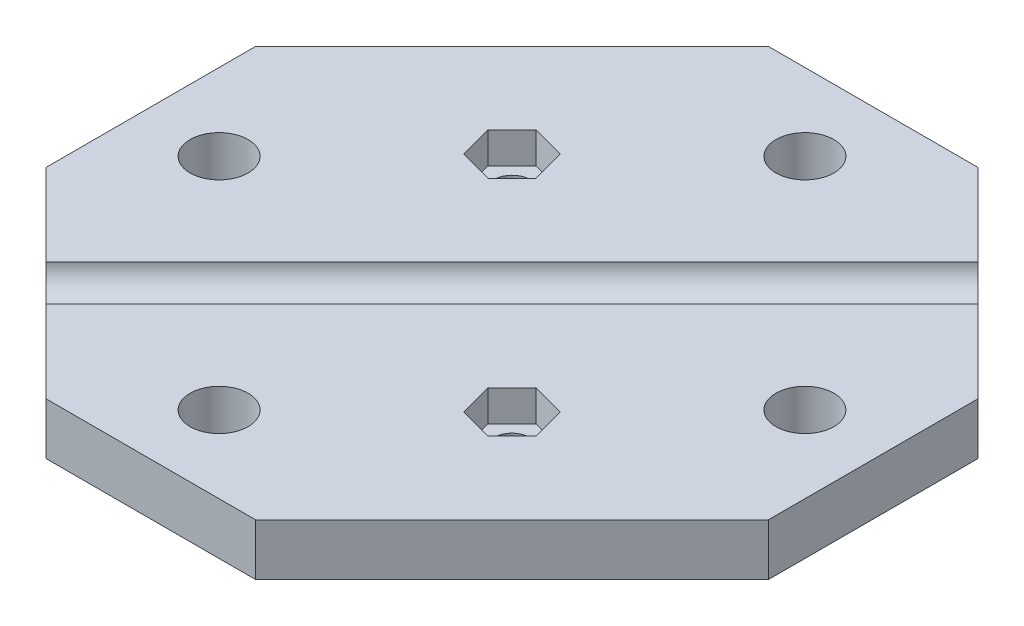
ISO-10303-21;
HEADER;
FILE_DESCRIPTION(('STEP AP214'),'2;1');
FILE_NAME('part.step','',(''),(''),'','','');
FILE_SCHEMA(('AUTOMOTIVE_DESIGN { 1 0 10303 214 1 1 1 1 }'));
ENDSEC;
DATA;
#1=APPLICATION_CONTEXT('core data for automotive mechanical design processes');
#2=APPLICATION_PROTOCOL_DEFINITION('international standard','automotive_design',2000,#1);
#3=PRODUCT_CONTEXT('',#1,'mechanical');
#4=PRODUCT('Part','Part','',(#3));
#5=PRODUCT_RELATED_PRODUCT_CATEGORY('part','',(#4));
#6=PRODUCT_DEFINITION_FORMATION('','',#4);
#7=PRODUCT_DEFINITION_CONTEXT('part definition',#1,'design');
#8=PRODUCT_DEFINITION('design','',#6,#7);
#9=PRODUCT_DEFINITION_SHAPE('','',#8);
#10=(LENGTH_UNIT() NAMED_UNIT(*) SI_UNIT(.MILLI.,.METRE.));
#11=(NAMED_UNIT(*) PLANE_ANGLE_UNIT() SI_UNIT($,.RADIAN.));
#12=(NAMED_UNIT(*) SI_UNIT($,.STERADIAN.) SOLID_ANGLE_UNIT());
#13=UNCERTAINTY_MEASURE_WITH_UNIT(LENGTH_MEASURE(1.E-05),#10,'distance_accuracy_value','');
#14=(GEOMETRIC_REPRESENTATION_CONTEXT(3) GLOBAL_UNCERTAINTY_ASSIGNED_CONTEXT((#13)) GLOBAL_UNIT_ASSIGNED_CONTEXT((#10,
#11,#12)) REPRESENTATION_CONTEXT('',''));
#15=CARTESIAN_POINT('',(0.,0.,0.));
#16=DIRECTION('',(0.,0.,1.));
#17=DIRECTION('',(1.,0.,0.));
#18=AXIS2_PLACEMENT_3D('',#15,#16,#17);
#19=CARTESIAN_POINT('',(0.,5.,0.));
#20=DIRECTION('',(0.,-1.,0.));
#21=DIRECTION('',(0.,0.,-1.));
#22=AXIS2_PLACEMENT_3D('',#19,#20,#21);
#23=PLANE('',#22);
#24=DIRECTION('',(-0.965925826289068,0.,-0.258819045102523));
#25=VECTOR('',#24,1.);
#26=CARTESIAN_POINT('',(-16.5869477278591,5.,-21.2409782391472));
#27=LINE('',#26,#25);
#28=CARTESIAN_POINT('',(-16.5869477278591,5.,-21.2409782391472));
#29=VERTEX_POINT('',#28);
#30=CARTESIAN_POINT('',(-19.7657096820628,5.,-22.0927249377069));
#31=VERTEX_POINT('',#30);
#32=EDGE_CURVE('E241',#29,#31,#27,.T.);
#33=ORIENTED_EDGE('',*,*,#32,.F.);
#34=DIRECTION('',(-0.258819045102519,0.,-0.965925826289069));
#35=VECTOR('',#34,1.);
#36=CARTESIAN_POINT('',(-15.7352010292995,5.,-18.0622162849435));
#37=LINE('',#36,#35);
#38=CARTESIAN_POINT('',(-15.7352010292995,5.,-18.0622162849435));
#39=VERTEX_POINT('',#38);
#40=EDGE_CURVE('E60',#39,#29,#37,.T.);
#41=ORIENTED_EDGE('',*,*,#40,.F.);
#42=DIRECTION('',(0.707106781186549,0.,-0.707106781186546));
#43=VECTOR('',#42,1.);
#44=CARTESIAN_POINT('',(-18.0622162849435,5.,-15.7352010292995));
#45=LINE('',#44,#43);
#46=CARTESIAN_POINT('',(-18.0622162849435,5.,-15.7352010292995));
#47=VERTEX_POINT('',#46);
#48=EDGE_CURVE('E218',#47,#39,#45,.T.);
#49=ORIENTED_EDGE('',*,*,#48,.F.);
#50=DIRECTION('',(0.965925826289068,0.,0.258819045102523));
#51=VECTOR('',#50,1.);
#52=CARTESIAN_POINT('',(-21.2409782391472,5.,-16.5869477278592));
#53=LINE('',#52,#51);
#54=CARTESIAN_POINT('',(-21.2409782391472,5.,-16.5869477278592));
#55=VERTEX_POINT('',#54);
#56=EDGE_CURVE('E222',#55,#47,#53,.T.);
#57=ORIENTED_EDGE('',*,*,#56,.F.);
#58=DIRECTION('',(0.258819045102518,0.,0.965925826289069));
#59=VECTOR('',#58,1.);
#60=CARTESIAN_POINT('',(-22.0927249377068,5.,-19.7657096820628));
#61=LINE('',#60,#59);
#62=CARTESIAN_POINT('',(-22.0927249377068,5.,-19.7657096820628));
#63=VERTEX_POINT('',#62);
#64=EDGE_CURVE('E248',#63,#55,#61,.T.);
#65=ORIENTED_EDGE('',*,*,#64,.F.);
#66=DIRECTION('',(-0.707106781186549,0.,0.707106781186546));
#67=VECTOR('',#66,1.);
#68=CARTESIAN_POINT('',(-19.7657096820628,5.,-22.0927249377069));
#69=LINE('',#68,#67);
#70=EDGE_CURVE('E244',#31,#63,#69,.T.);
#71=ORIENTED_EDGE('',*,*,#70,.F.);
#72=EDGE_LOOP('',(#33,#41,#49,#57,#65,#71));
#73=FACE_BOUND('',#72,.T.);
#74=CARTESIAN_POINT('',(-32.8793219119375,5.,-4.59505066447559));
#75=DIRECTION('',(0.,1.,0.));
#76=DIRECTION('',(0.,0.,1.));
#77=AXIS2_PLACEMENT_3D('',#74,#75,#76);
#78=CIRCLE('',#77,2.8);
#79=CARTESIAN_POINT('',(-32.8793219119375,5.,-1.79505066447559));
#80=VERTEX_POINT('',#79);
#81=EDGE_CURVE('E348',#80,#80,#78,.T.);
#82=ORIENTED_EDGE('',*,*,#81,.F.);
#83=EDGE_LOOP('',(#82));
#84=FACE_BOUND('',#83,.T.);
#85=CARTESIAN_POINT('',(-4.59505066447554,5.,-32.8793219119374));
#86=DIRECTION('',(0.,1.,0.));
#87=DIRECTION('',(0.,0.,1.));
#88=AXIS2_PLACEMENT_3D('',#85,#86,#87);
#89=CIRCLE('',#88,2.8);
#90=CARTESIAN_POINT('',(-4.59505066447554,5.,-30.0793219119374));
#91=VERTEX_POINT('',#90);
#92=EDGE_CURVE('E356',#91,#91,#89,.T.);
#93=ORIENTED_EDGE('',*,*,#92,.F.);
#94=EDGE_LOOP('',(#93));
#95=FACE_BOUND('',#94,.T.);
#96=DIRECTION('',(0.707106781186547,0.,0.707106781186549));
#97=VECTOR('',#96,1.);
#98=CARTESIAN_POINT('',(-40.3039431143962,5.,4.69479422713291));
#99=LINE('',#98,#97);
#100=CARTESIAN_POINT('',(-40.3039431143962,5.,4.69479422713291));
#101=VERTEX_POINT('',#100);
#102=CARTESIAN_POINT('',(-32.3977201941393,5.,12.6010171473899));
#103=VERTEX_POINT('',#102);
#104=EDGE_CURVE('E386',#101,#103,#99,.T.);
#105=ORIENTED_EDGE('',*,*,#104,.T.);
#106=DIRECTION('',(0.707106781186549,0.,-0.707106781186546));
#107=VECTOR('',#106,1.);
#108=CARTESIAN_POINT('',(-42.0727100673626,5.,22.2760070206132));
#109=LINE('',#108,#107);
#110=CARTESIAN_POINT('',(12.60101714739,5.,-32.3977201941392));
#111=VERTEX_POINT('',#110);
#112=EDGE_CURVE('E340',#103,#111,#109,.T.);
#113=ORIENTED_EDGE('',*,*,#112,.T.);
#114=DIRECTION('',(-0.707106781186546,0.,-0.707106781186549));
#115=VECTOR('',#114,1.);
#116=CARTESIAN_POINT('',(4.69479422713301,5.,-40.3039431143962));
#117=LINE('',#116,#115);
#118=CARTESIAN_POINT('',(4.69479422713301,5.,-40.3039431143962));
#119=VERTEX_POINT('',#118);
#120=EDGE_CURVE('E399',#111,#119,#117,.T.);
#121=ORIENTED_EDGE('',*,*,#120,.T.);
#122=DIRECTION('',(-1.,0.,0.));
#123=VECTOR('',#122,1.);
#124=CARTESIAN_POINT('',(-15.555205772867,5.,-40.3039431143962));
#125=LINE('',#124,#123);
#126=CARTESIAN_POINT('',(-15.555205772867,5.,-40.3039431143962));
#127=VERTEX_POINT('',#126);
#128=EDGE_CURVE('E404',#119,#127,#125,.T.);
#129=ORIENTED_EDGE('',*,*,#128,.T.);
#130=DIRECTION('',(-0.707106781186549,0.,0.707106781186546));
#131=VECTOR('',#130,1.);
#132=CARTESIAN_POINT('',(-40.3039431143962,5.,-15.5552057728671));
#133=LINE('',#132,#131);
#134=CARTESIAN_POINT('',(-40.3039431143962,5.,-15.5552057728671));
#135=VERTEX_POINT('',#134);
#136=EDGE_CURVE('E407',#127,#135,#133,.T.);
#137=ORIENTED_EDGE('',*,*,#136,.T.);
#138=DIRECTION('',(0.,0.,1.));
#139=VECTOR('',#138,1.);
#140=CARTESIAN_POINT('',(-40.3039431143962,5.,-15.5552057728671));
#141=LINE('',#140,#139);
#142=EDGE_CURVE('E380',#135,#101,#141,.T.);
#143=ORIENTED_EDGE('',*,*,#142,.T.);
#144=EDGE_LOOP('',(#105,#113,#121,#129,#137,#143));
#145=FACE_BOUND('',#144,.T.);
#146=ADVANCED_FACE('F44',(#73,#84,#95,#145),#23,.F.);
#147=DIRECTION('',(-0.965925826289068,0.,-0.258819045102523));
#148=VECTOR('',#147,1.);
#149=CARTESIAN_POINT('',(4.97980909833059,5.,0.325778587042475));
#150=LINE('',#149,#148);
#151=CARTESIAN_POINT('',(4.97980909833059,5.,0.325778587042475));
#152=VERTEX_POINT('',#151);
#153=CARTESIAN_POINT('',(1.80104714412692,5.,-0.525968111517182));
#154=VERTEX_POINT('',#153);
#155=EDGE_CURVE('E307',#152,#154,#150,.T.);
#156=ORIENTED_EDGE('',*,*,#155,.F.);
#157=DIRECTION('',(-0.258819045102519,0.,-0.965925826289069));
#158=VECTOR('',#157,1.);
#159=CARTESIAN_POINT('',(5.83155579689024,5.,3.50454054124615));
#160=LINE('',#159,#158);
#161=CARTESIAN_POINT('',(5.83155579689024,5.,3.50454054124615));
#162=VERTEX_POINT('',#161);
#163=EDGE_CURVE('E68',#162,#152,#160,.T.);
#164=ORIENTED_EDGE('',*,*,#163,.F.);
#165=DIRECTION('',(0.707106781186549,0.,-0.707106781186546));
#166=VECTOR('',#165,1.);
#167=CARTESIAN_POINT('',(3.50454054124621,5.,5.83155579689016));
#168=LINE('',#167,#166);
#169=CARTESIAN_POINT('',(3.50454054124621,5.,5.83155579689016));
#170=VERTEX_POINT('',#169);
#171=EDGE_CURVE('E290',#170,#162,#168,.T.);
#172=ORIENTED_EDGE('',*,*,#171,.F.);
#173=DIRECTION('',(0.965925826289068,0.,0.258819045102523));
#174=VECTOR('',#173,1.);
#175=CARTESIAN_POINT('',(0.325778587042545,5.,4.9798090983305));
#176=LINE('',#175,#174);
#177=CARTESIAN_POINT('',(0.325778587042545,5.,4.9798090983305));
#178=VERTEX_POINT('',#177);
#179=EDGE_CURVE('E294',#178,#170,#176,.T.);
#180=ORIENTED_EDGE('',*,*,#179,.F.);
#181=DIRECTION('',(0.258819045102519,0.,0.965925826289069));
#182=VECTOR('',#181,1.);
#183=CARTESIAN_POINT('',(-0.5259681115171,5.,1.80104714412683));
#184=LINE('',#183,#182);
#185=CARTESIAN_POINT('',(-0.5259681115171,5.,1.80104714412683));
#186=VERTEX_POINT('',#185);
#187=EDGE_CURVE('E299',#186,#178,#184,.T.);
#188=ORIENTED_EDGE('',*,*,#187,.F.);
#189=DIRECTION('',(-0.707106781186549,0.,0.707106781186546));
#190=VECTOR('',#189,1.);
#191=CARTESIAN_POINT('',(1.80104714412692,5.,-0.525968111517182));
#192=LINE('',#191,#190);
#193=EDGE_CURVE('E303',#154,#186,#192,.T.);
#194=ORIENTED_EDGE('',*,*,#193,.F.);
#195=EDGE_LOOP('',(#156,#164,#172,#180,#188,#194));
#196=FACE_BOUND('',#195,.T.);
#197=CARTESIAN_POINT('',(24.0427739735796,5.,-20.9559633679495));
#198=VERTEX_POINT('',#197);
#199=CARTESIAN_POINT('',(16.1365510533227,5.,-28.8621862882065));
#200=VERTEX_POINT('',#199);
#201=EDGE_CURVE('E400',#198,#200,#117,.T.);
#202=ORIENTED_EDGE('',*,*,#201,.T.);
#203=DIRECTION('',(0.707106781186549,0.,-0.707106781186546));
#204=VECTOR('',#203,1.);
#205=CARTESIAN_POINT('',(-38.5371761614299,5.,25.8115409265459));
#206=LINE('',#205,#204);
#207=CARTESIAN_POINT('',(-28.8621862882066,5.,16.1365510533226));
#208=VERTEX_POINT('',#207);
#209=EDGE_CURVE('E341',#208,#200,#206,.T.);
#210=ORIENTED_EDGE('',*,*,#209,.F.);
#211=CARTESIAN_POINT('',(-20.9559633679496,5.,24.0427739735796));
#212=VERTEX_POINT('',#211);
#213=EDGE_CURVE('E384',#208,#212,#99,.T.);
#214=ORIENTED_EDGE('',*,*,#213,.T.);
#215=DIRECTION('',(1.,0.,0.));
#216=VECTOR('',#215,1.);
#217=CARTESIAN_POINT('',(-0.705963367949583,5.,24.0427739735796));
#218=LINE('',#217,#216);
#219=CARTESIAN_POINT('',(-0.705963367949583,5.,24.0427739735796));
#220=VERTEX_POINT('',#219);
#221=EDGE_CURVE('E390',#212,#220,#218,.T.);
#222=ORIENTED_EDGE('',*,*,#221,.T.);
#223=DIRECTION('',(0.707106781186549,0.,-0.707106781186546));
#224=VECTOR('',#223,1.);
#225=CARTESIAN_POINT('',(-0.705963367949583,5.,24.0427739735796));
#226=LINE('',#225,#224);
#227=CARTESIAN_POINT('',(24.0427739735796,5.,-0.705963367949539));
#228=VERTEX_POINT('',#227);
#229=EDGE_CURVE('E393',#220,#228,#226,.T.);
#230=ORIENTED_EDGE('',*,*,#229,.T.);
#231=DIRECTION('',(0.,0.,-1.));
#232=VECTOR('',#231,1.);
#233=CARTESIAN_POINT('',(24.0427739735796,5.,-0.705963367949539));
#234=LINE('',#233,#232);
#235=EDGE_CURVE('E396',#228,#198,#234,.T.);
#236=ORIENTED_EDGE('',*,*,#235,.T.);
#237=EDGE_LOOP('',(#202,#210,#214,#222,#230,#236));
#238=FACE_BOUND('',#237,.T.);
#239=CARTESIAN_POINT('',(-11.6661184763411,5.,16.6181527711208));
#240=DIRECTION('',(0.,1.,0.));
#241=DIRECTION('',(0.,0.,1.));
#242=AXIS2_PLACEMENT_3D('',#239,#240,#241);
#243=CIRCLE('',#242,2.8);
#244=CARTESIAN_POINT('',(-11.6661184763411,5.,19.4181527711208));
#245=VERTEX_POINT('',#244);
#246=EDGE_CURVE('E372',#245,#245,#243,.T.);
#247=ORIENTED_EDGE('',*,*,#246,.F.);
#248=EDGE_LOOP('',(#247));
#249=FACE_BOUND('',#248,.T.);
#250=CARTESIAN_POINT('',(16.6181527711209,5.,-11.666118476341));
#251=DIRECTION('',(0.,1.,0.));
#252=DIRECTION('',(0.,0.,1.));
#253=AXIS2_PLACEMENT_3D('',#250,#251,#252);
#254=CIRCLE('',#253,2.8);
#255=CARTESIAN_POINT('',(16.6181527711209,5.,-8.86611847634102));
#256=VERTEX_POINT('',#255);
#257=EDGE_CURVE('E364',#256,#256,#254,.T.);
#258=ORIENTED_EDGE('',*,*,#257,.F.);
#259=EDGE_LOOP('',(#258));
#260=FACE_BOUND('',#259,.T.);
#261=ADVANCED_FACE('F483',(#196,#238,#249,#260),#23,.F.);
#262=CARTESIAN_POINT('',(0.,0.,0.));
#263=DIRECTION('',(0.,-1.,0.));
#264=DIRECTION('',(0.,0.,-1.));
#265=AXIS2_PLACEMENT_3D('',#262,#263,#264);
#266=PLANE('',#265);
#267=CARTESIAN_POINT('',(-18.9139629835031,0.,-18.9139629835032));
#268=DIRECTION('',(0.,-1.,0.));
#269=DIRECTION('',(0.,0.,-1.));
#270=AXIS2_PLACEMENT_3D('',#267,#268,#269);
#271=CIRCLE('',#270,1.75);
#272=CARTESIAN_POINT('',(-18.9139629835031,0.,-20.6639629835032));
#273=VERTEX_POINT('',#272);
#274=EDGE_CURVE('E289',#273,#273,#271,.F.);
#275=ORIENTED_EDGE('',*,*,#274,.T.);
#276=EDGE_LOOP('',(#275));
#277=FACE_BOUND('',#276,.T.);
#278=CARTESIAN_POINT('',(2.65279384268654,0.,2.65279384268653));
#279=DIRECTION('',(0.,-1.,0.));
#280=DIRECTION('',(0.,0.,-1.));
#281=AXIS2_PLACEMENT_3D('',#278,#279,#280);
#282=CIRCLE('',#281,1.75);
#283=CARTESIAN_POINT('',(2.65279384268654,0.,0.902793842686534));
#284=VERTEX_POINT('',#283);
#285=EDGE_CURVE('E785',#284,#284,#282,.F.);
#286=ORIENTED_EDGE('',*,*,#285,.T.);
#287=EDGE_LOOP('',(#286));
#288=FACE_BOUND('',#287,.T.);
#289=CARTESIAN_POINT('',(-4.59505066447554,0.,-32.8793219119374));
#290=DIRECTION('',(0.,1.,0.));
#291=DIRECTION('',(0.,0.,1.));
#292=AXIS2_PLACEMENT_3D('',#289,#290,#291);
#293=CIRCLE('',#292,2.8);
#294=CARTESIAN_POINT('',(-4.59505066447554,0.,-30.0793219119374));
#295=VERTEX_POINT('',#294);
#296=EDGE_CURVE('E352',#295,#295,#293,.T.);
#297=ORIENTED_EDGE('',*,*,#296,.T.);
#298=EDGE_LOOP('',(#297));
#299=FACE_BOUND('',#298,.T.);
#300=CARTESIAN_POINT('',(-11.6661184763411,0.,16.6181527711208));
#301=DIRECTION('',(0.,1.,0.));
#302=DIRECTION('',(0.,0.,1.));
#303=AXIS2_PLACEMENT_3D('',#300,#301,#302);
#304=CIRCLE('',#303,2.8);
#305=CARTESIAN_POINT('',(-11.6661184763411,0.,19.4181527711208));
#306=VERTEX_POINT('',#305);
#307=EDGE_CURVE('E368',#306,#306,#304,.T.);
#308=ORIENTED_EDGE('',*,*,#307,.T.);
#309=EDGE_LOOP('',(#308));
#310=FACE_BOUND('',#309,.T.);
#311=DIRECTION('',(0.,0.,1.));
#312=VECTOR('',#311,1.);
#313=CARTESIAN_POINT('',(-40.3039431143962,0.,-15.5552057728671));
#314=LINE('',#313,#312);
#315=CARTESIAN_POINT('',(-40.3039431143962,0.,-15.5552057728671));
#316=VERTEX_POINT('',#315);
#317=CARTESIAN_POINT('',(-40.3039431143962,0.,4.69479422713291));
#318=VERTEX_POINT('',#317);
#319=EDGE_CURVE('E376',#316,#318,#314,.T.);
#320=ORIENTED_EDGE('',*,*,#319,.F.);
#321=DIRECTION('',(-0.707106781186549,0.,0.707106781186546));
#322=VECTOR('',#321,1.);
#323=CARTESIAN_POINT('',(-40.3039431143962,0.,-15.5552057728671));
#324=LINE('',#323,#322);
#325=CARTESIAN_POINT('',(-15.555205772867,0.,-40.3039431143962));
#326=VERTEX_POINT('',#325);
#327=EDGE_CURVE('E385',#326,#316,#324,.T.);
#328=ORIENTED_EDGE('',*,*,#327,.F.);
#329=DIRECTION('',(-1.,0.,0.));
#330=VECTOR('',#329,1.);
#331=CARTESIAN_POINT('',(-15.555205772867,0.,-40.3039431143962));
#332=LINE('',#331,#330);
#333=CARTESIAN_POINT('',(4.69479422713301,0.,-40.3039431143962));
#334=VERTEX_POINT('',#333);
#335=EDGE_CURVE('E429',#334,#326,#332,.T.);
#336=ORIENTED_EDGE('',*,*,#335,.F.);
#337=DIRECTION('',(-0.707106781186546,0.,-0.707106781186549));
#338=VECTOR('',#337,1.);
#339=CARTESIAN_POINT('',(4.69479422713301,0.,-40.3039431143962));
#340=LINE('',#339,#338);
#341=CARTESIAN_POINT('',(24.0427739735796,0.,-20.9559633679495));
#342=VERTEX_POINT('',#341);
#343=EDGE_CURVE('E426',#342,#334,#340,.T.);
#344=ORIENTED_EDGE('',*,*,#343,.F.);
#345=DIRECTION('',(0.,0.,-1.));
#346=VECTOR('',#345,1.);
#347=CARTESIAN_POINT('',(24.0427739735796,0.,-0.705963367949539));
#348=LINE('',#347,#346);
#349=CARTESIAN_POINT('',(24.0427739735796,0.,-0.705963367949539));
#350=VERTEX_POINT('',#349);
#351=EDGE_CURVE('E423',#350,#342,#348,.T.);
#352=ORIENTED_EDGE('',*,*,#351,.F.);
#353=DIRECTION('',(0.707106781186549,0.,-0.707106781186546));
#354=VECTOR('',#353,1.);
#355=CARTESIAN_POINT('',(-0.705963367949583,0.,24.0427739735796));
#356=LINE('',#355,#354);
#357=CARTESIAN_POINT('',(-0.705963367949583,0.,24.0427739735796));
#358=VERTEX_POINT('',#357);
#359=EDGE_CURVE('E420',#358,#350,#356,.T.);
#360=ORIENTED_EDGE('',*,*,#359,.F.);
#361=DIRECTION('',(1.,0.,0.));
#362=VECTOR('',#361,1.);
#363=CARTESIAN_POINT('',(-0.705963367949583,0.,24.0427739735796));
#364=LINE('',#363,#362);
#365=CARTESIAN_POINT('',(-20.9559633679496,0.,24.0427739735796));
#366=VERTEX_POINT('',#365);
#367=EDGE_CURVE('E417',#366,#358,#364,.T.);
#368=ORIENTED_EDGE('',*,*,#367,.F.);
#369=DIRECTION('',(0.707106781186547,0.,0.707106781186549));
#370=VECTOR('',#369,1.);
#371=CARTESIAN_POINT('',(-40.3039431143962,0.,4.69479422713291));
#372=LINE('',#371,#370);
#373=EDGE_CURVE('E414',#318,#366,#372,.T.);
#374=ORIENTED_EDGE('',*,*,#373,.F.);
#375=EDGE_LOOP('',(#320,#328,#336,#344,#352,#360,#368,#374));
#376=FACE_BOUND('',#375,.T.);
#377=CARTESIAN_POINT('',(16.6181527711209,0.,-11.666118476341));
#378=DIRECTION('',(0.,1.,0.));
#379=DIRECTION('',(0.,0.,1.));
#380=AXIS2_PLACEMENT_3D('',#377,#378,#379);
#381=CIRCLE('',#380,2.8);
#382=CARTESIAN_POINT('',(16.6181527711209,0.,-8.86611847634102));
#383=VERTEX_POINT('',#382);
#384=EDGE_CURVE('E360',#383,#383,#381,.T.);
#385=ORIENTED_EDGE('',*,*,#384,.T.);
#386=EDGE_LOOP('',(#385));
#387=FACE_BOUND('',#386,.T.);
#388=CARTESIAN_POINT('',(-32.8793219119375,0.,-4.59505066447559));
#389=DIRECTION('',(0.,1.,0.));
#390=DIRECTION('',(0.,0.,1.));
#391=AXIS2_PLACEMENT_3D('',#388,#389,#390);
#392=CIRCLE('',#391,2.8);
#393=CARTESIAN_POINT('',(-32.8793219119375,0.,-1.79505066447559));
#394=VERTEX_POINT('',#393);
#395=EDGE_CURVE('E344',#394,#394,#392,.T.);
#396=ORIENTED_EDGE('',*,*,#395,.T.);
#397=EDGE_LOOP('',(#396));
#398=FACE_BOUND('',#397,.T.);
#399=ADVANCED_FACE('F469',(#277,#288,#299,#310,#376,#387,#398),#266,.T.);
#400=CARTESIAN_POINT('',(-40.3039431143962,5.,-15.5552057728671));
#401=DIRECTION('',(1.,0.,0.));
#402=DIRECTION('',(0.,0.,-1.));
#403=AXIS2_PLACEMENT_3D('',#400,#401,#402);
#404=PLANE('',#403);
#405=ORIENTED_EDGE('',*,*,#319,.T.);
#406=DIRECTION('',(0.,-1.,0.));
#407=VECTOR('',#406,1.);
#408=CARTESIAN_POINT('',(-40.3039431143962,5.,4.69479422713291));
#409=LINE('',#408,#407);
#410=EDGE_CURVE('E11',#101,#318,#409,.T.);
#411=ORIENTED_EDGE('',*,*,#410,.F.);
#412=ORIENTED_EDGE('',*,*,#142,.F.);
#413=DIRECTION('',(0.,-1.,0.));
#414=VECTOR('',#413,1.);
#415=CARTESIAN_POINT('',(-40.3039431143962,5.,-15.5552057728671));
#416=LINE('',#415,#414);
#417=EDGE_CURVE('E410',#135,#316,#416,.T.);
#418=ORIENTED_EDGE('',*,*,#417,.T.);
#419=EDGE_LOOP('',(#405,#411,#412,#418));
#420=FACE_BOUND('',#419,.T.);
#421=ADVANCED_FACE('F46',(#420),#404,.F.);
#422=CARTESIAN_POINT('',(-40.3039431143962,5.,4.69479422713291));
#423=DIRECTION('',(0.707106781186548,0.,-0.707106781186547));
#424=DIRECTION('',(-0.707106781186547,0.,-0.707106781186548));
#425=AXIS2_PLACEMENT_3D('',#422,#423,#424);
#426=PLANE('',#425);
#427=ORIENTED_EDGE('',*,*,#213,.F.);
#428=CARTESIAN_POINT('',(-30.6299532411729,5.,14.3687841003562));
#429=DIRECTION('',(0.707106781186548,0.,-0.707106781186547));
#430=DIRECTION('',(-0.707106781186547,0.,-0.707106781186548));
#431=AXIS2_PLACEMENT_3D('',#428,#429,#430);
#432=CIRCLE('',#431,2.5);
#433=EDGE_CURVE('E258',#103,#208,#432,.F.);
#434=ORIENTED_EDGE('',*,*,#433,.F.);
#435=ORIENTED_EDGE('',*,*,#104,.F.);
#436=ORIENTED_EDGE('',*,*,#410,.T.);
#437=ORIENTED_EDGE('',*,*,#373,.T.);
#438=DIRECTION('',(0.,-1.,0.));
#439=VECTOR('',#438,1.);
#440=CARTESIAN_POINT('',(-20.9559633679496,5.,24.0427739735796));
#441=LINE('',#440,#439);
#442=EDGE_CURVE('E53',#212,#366,#441,.T.);
#443=ORIENTED_EDGE('',*,*,#442,.F.);
#444=EDGE_LOOP('',(#427,#434,#435,#436,#437,#443));
#445=FACE_BOUND('',#444,.T.);
#446=ADVANCED_FACE('F508',(#445),#426,.F.);
#447=CARTESIAN_POINT('',(-0.705963367949583,5.,24.0427739735796));
#448=DIRECTION('',(0.,0.,-1.));
#449=DIRECTION('',(-1.,0.,0.));
#450=AXIS2_PLACEMENT_3D('',#447,#448,#449);
#451=PLANE('',#450);
#452=ORIENTED_EDGE('',*,*,#367,.T.);
#453=DIRECTION('',(0.,-1.,0.));
#454=VECTOR('',#453,1.);
#455=CARTESIAN_POINT('',(-0.705963367949583,5.,24.0427739735796));
#456=LINE('',#455,#454);
#457=EDGE_CURVE('E453',#220,#358,#456,.T.);
#458=ORIENTED_EDGE('',*,*,#457,.F.);
#459=ORIENTED_EDGE('',*,*,#221,.F.);
#460=ORIENTED_EDGE('',*,*,#442,.T.);
#461=EDGE_LOOP('',(#452,#458,#459,#460));
#462=FACE_BOUND('',#461,.T.);
#463=ADVANCED_FACE('F462',(#462),#451,.F.);
#464=CARTESIAN_POINT('',(-0.705963367949583,5.,24.0427739735796));
#465=DIRECTION('',(-0.707106781186546,0.,-0.707106781186549));
#466=DIRECTION('',(-0.707106781186549,0.,0.707106781186546));
#467=AXIS2_PLACEMENT_3D('',#464,#465,#466);
#468=PLANE('',#467);
#469=ORIENTED_EDGE('',*,*,#359,.T.);
#470=DIRECTION('',(0.,-1.,0.));
#471=VECTOR('',#470,1.);
#472=CARTESIAN_POINT('',(24.0427739735796,5.,-0.705963367949539));
#473=LINE('',#472,#471);
#474=EDGE_CURVE('E449',#228,#350,#473,.T.);
#475=ORIENTED_EDGE('',*,*,#474,.F.);
#476=ORIENTED_EDGE('',*,*,#229,.F.);
#477=ORIENTED_EDGE('',*,*,#457,.T.);
#478=EDGE_LOOP('',(#469,#475,#476,#477));
#479=FACE_BOUND('',#478,.T.);
#480=ADVANCED_FACE('F475',(#479),#468,.F.);
#481=CARTESIAN_POINT('',(24.0427739735796,5.,-0.705963367949539));
#482=DIRECTION('',(-1.,0.,0.));
#483=DIRECTION('',(0.,0.,1.));
#484=AXIS2_PLACEMENT_3D('',#481,#482,#483);
#485=PLANE('',#484);
#486=ORIENTED_EDGE('',*,*,#351,.T.);
#487=DIRECTION('',(0.,-1.,0.));
#488=VECTOR('',#487,1.);
#489=CARTESIAN_POINT('',(24.0427739735796,5.,-20.9559633679495));
#490=LINE('',#489,#488);
#491=EDGE_CURVE('E445',#198,#342,#490,.T.);
#492=ORIENTED_EDGE('',*,*,#491,.F.);
#493=ORIENTED_EDGE('',*,*,#235,.F.);
#494=ORIENTED_EDGE('',*,*,#474,.T.);
#495=EDGE_LOOP('',(#486,#492,#493,#494));
#496=FACE_BOUND('',#495,.T.);
#497=ADVANCED_FACE('F479',(#496),#485,.F.);
#498=CARTESIAN_POINT('',(4.69479422713301,5.,-40.3039431143962));
#499=DIRECTION('',(-0.707106781186549,0.,0.707106781186546));
#500=DIRECTION('',(0.707106781186546,0.,0.707106781186549));
#501=AXIS2_PLACEMENT_3D('',#498,#499,#500);
#502=PLANE('',#501);
#503=ORIENTED_EDGE('',*,*,#120,.F.);
#504=CARTESIAN_POINT('',(14.3687841003563,5.,-30.6299532411729));
#505=DIRECTION('',(0.707106781186549,0.,-0.707106781186546));
#506=DIRECTION('',(-0.707106781186546,0.,-0.707106781186549));
#507=AXIS2_PLACEMENT_3D('',#504,#505,#506);
#508=CIRCLE('',#507,2.5);
#509=EDGE_CURVE('E337',#200,#111,#508,.T.);
#510=ORIENTED_EDGE('',*,*,#509,.F.);
#511=ORIENTED_EDGE('',*,*,#201,.F.);
#512=ORIENTED_EDGE('',*,*,#491,.T.);
#513=ORIENTED_EDGE('',*,*,#343,.T.);
#514=DIRECTION('',(0.,-1.,0.));
#515=VECTOR('',#514,1.);
#516=CARTESIAN_POINT('',(4.69479422713301,5.,-40.3039431143962));
#517=LINE('',#516,#515);
#518=EDGE_CURVE('E441',#119,#334,#517,.T.);
#519=ORIENTED_EDGE('',*,*,#518,.F.);
#520=EDGE_LOOP('',(#503,#510,#511,#512,#513,#519));
#521=FACE_BOUND('',#520,.T.);
#522=ADVANCED_FACE('F496',(#521),#502,.F.);
#523=CARTESIAN_POINT('',(-15.555205772867,5.,-40.3039431143962));
#524=DIRECTION('',(0.,0.,1.));
#525=DIRECTION('',(1.,0.,0.));
#526=AXIS2_PLACEMENT_3D('',#523,#524,#525);
#527=PLANE('',#526);
#528=ORIENTED_EDGE('',*,*,#335,.T.);
#529=DIRECTION('',(0.,-1.,0.));
#530=VECTOR('',#529,1.);
#531=CARTESIAN_POINT('',(-15.555205772867,5.,-40.3039431143962));
#532=LINE('',#531,#530);
#533=EDGE_CURVE('E437',#127,#326,#532,.T.);
#534=ORIENTED_EDGE('',*,*,#533,.F.);
#535=ORIENTED_EDGE('',*,*,#128,.F.);
#536=ORIENTED_EDGE('',*,*,#518,.T.);
#537=EDGE_LOOP('',(#528,#534,#535,#536));
#538=FACE_BOUND('',#537,.T.);
#539=ADVANCED_FACE('F499',(#538),#527,.F.);
#540=CARTESIAN_POINT('',(-40.3039431143962,5.,-15.5552057728671));
#541=DIRECTION('',(0.707106781186546,0.,0.707106781186549));
#542=DIRECTION('',(0.707106781186549,0.,-0.707106781186546));
#543=AXIS2_PLACEMENT_3D('',#540,#541,#542);
#544=PLANE('',#543);
#545=ORIENTED_EDGE('',*,*,#327,.T.);
#546=ORIENTED_EDGE('',*,*,#417,.F.);
#547=ORIENTED_EDGE('',*,*,#136,.F.);
#548=ORIENTED_EDGE('',*,*,#533,.T.);
#549=EDGE_LOOP('',(#545,#546,#547,#548));
#550=FACE_BOUND('',#549,.T.);
#551=ADVANCED_FACE('F504',(#550),#544,.F.);
#552=CARTESIAN_POINT('',(-11.6661184763411,5.,16.6181527711208));
#553=DIRECTION('',(0.,-1.,0.));
#554=DIRECTION('',(0.,0.,-1.));
#555=AXIS2_PLACEMENT_3D('',#552,#553,#554);
#556=CYLINDRICAL_SURFACE('',#555,2.8);
#557=ORIENTED_EDGE('',*,*,#246,.T.);
#558=EDGE_LOOP('',(#557));
#559=FACE_BOUND('',#558,.T.);
#560=ORIENTED_EDGE('',*,*,#307,.F.);
#561=EDGE_LOOP('',(#560));
#562=FACE_BOUND('',#561,.T.);
#563=ADVANCED_FACE('F536',(#559,#562),#556,.F.);
#564=CARTESIAN_POINT('',(16.6181527711209,5.,-11.666118476341));
#565=DIRECTION('',(0.,-1.,0.));
#566=DIRECTION('',(0.,0.,-1.));
#567=AXIS2_PLACEMENT_3D('',#564,#565,#566);
#568=CYLINDRICAL_SURFACE('',#567,2.8);
#569=ORIENTED_EDGE('',*,*,#257,.T.);
#570=EDGE_LOOP('',(#569));
#571=FACE_BOUND('',#570,.T.);
#572=ORIENTED_EDGE('',*,*,#384,.F.);
#573=EDGE_LOOP('',(#572));
#574=FACE_BOUND('',#573,.T.);
#575=ADVANCED_FACE('F591',(#571,#574),#568,.F.);
#576=CARTESIAN_POINT('',(-4.59505066447554,5.,-32.8793219119374));
#577=DIRECTION('',(0.,-1.,0.));
#578=DIRECTION('',(0.,0.,-1.));
#579=AXIS2_PLACEMENT_3D('',#576,#577,#578);
#580=CYLINDRICAL_SURFACE('',#579,2.8);
#581=ORIENTED_EDGE('',*,*,#92,.T.);
#582=EDGE_LOOP('',(#581));
#583=FACE_BOUND('',#582,.T.);
#584=ORIENTED_EDGE('',*,*,#296,.F.);
#585=EDGE_LOOP('',(#584));
#586=FACE_BOUND('',#585,.T.);
#587=ADVANCED_FACE('F523',(#583,#586),#580,.F.);
#588=CARTESIAN_POINT('',(-32.8793219119375,5.,-4.59505066447559));
#589=DIRECTION('',(0.,-1.,0.));
#590=DIRECTION('',(0.,0.,-1.));
#591=AXIS2_PLACEMENT_3D('',#588,#589,#590);
#592=CYLINDRICAL_SURFACE('',#591,2.8);
#593=ORIENTED_EDGE('',*,*,#81,.T.);
#594=EDGE_LOOP('',(#593));
#595=FACE_BOUND('',#594,.T.);
#596=ORIENTED_EDGE('',*,*,#395,.F.);
#597=EDGE_LOOP('',(#596));
#598=FACE_BOUND('',#597,.T.);
#599=ADVANCED_FACE('F513',(#595,#598),#592,.F.);
#600=CARTESIAN_POINT('',(-40.3049431143963,5.,24.0437739735795));
#601=DIRECTION('',(0.707106781186549,0.,-0.707106781186546));
#602=DIRECTION('',(-0.707106781186546,0.,-0.707106781186549));
#603=AXIS2_PLACEMENT_3D('',#600,#601,#602);
#604=CYLINDRICAL_SURFACE('',#603,2.5);
#605=ORIENTED_EDGE('',*,*,#433,.T.);
#606=ORIENTED_EDGE('',*,*,#209,.T.);
#607=ORIENTED_EDGE('',*,*,#509,.T.);
#608=ORIENTED_EDGE('',*,*,#112,.F.);
#609=EDGE_LOOP('',(#605,#606,#607,#608));
#610=FACE_BOUND('',#609,.T.);
#611=ADVANCED_FACE('F510',(#610),#604,.F.);
#612=CARTESIAN_POINT('',(5.83155579689024,2.,3.50454054124615));
#613=DIRECTION('',(0.965925826289069,0.,-0.258819045102519));
#614=DIRECTION('',(-0.258819045102519,0.,-0.965925826289069));
#615=AXIS2_PLACEMENT_3D('',#612,#613,#614);
#616=PLANE('',#615);
#617=ORIENTED_EDGE('',*,*,#163,.T.);
#618=DIRECTION('',(0.,1.,0.));
#619=VECTOR('',#618,1.);
#620=CARTESIAN_POINT('',(4.97980909833059,2.,0.325778587042475));
#621=LINE('',#620,#619);
#622=CARTESIAN_POINT('',(4.97980909833059,2.,0.325778587042475));
#623=VERTEX_POINT('',#622);
#624=EDGE_CURVE('E270',#623,#152,#621,.T.);
#625=ORIENTED_EDGE('',*,*,#624,.F.);
#626=DIRECTION('',(-0.258819045102519,0.,-0.965925826289069));
#627=VECTOR('',#626,1.);
#628=CARTESIAN_POINT('',(5.83155579689024,2.,3.50454054124615));
#629=LINE('',#628,#627);
#630=CARTESIAN_POINT('',(5.83155579689024,2.,3.50454054124615));
#631=VERTEX_POINT('',#630);
#632=EDGE_CURVE('E295',#631,#623,#629,.T.);
#633=ORIENTED_EDGE('',*,*,#632,.F.);
#634=DIRECTION('',(0.,1.,0.));
#635=VECTOR('',#634,1.);
#636=CARTESIAN_POINT('',(5.83155579689024,2.,3.50454054124615));
#637=LINE('',#636,#635);
#638=EDGE_CURVE('E286',#631,#162,#637,.T.);
#639=ORIENTED_EDGE('',*,*,#638,.T.);
#640=EDGE_LOOP('',(#617,#625,#633,#639));
#641=FACE_BOUND('',#640,.T.);
#642=ADVANCED_FACE('F512',(#641),#616,.F.);
#643=CARTESIAN_POINT('',(3.50454054124621,2.,5.83155579689016));
#644=DIRECTION('',(0.707106781186546,0.,0.707106781186549));
#645=DIRECTION('',(0.707106781186549,0.,-0.707106781186546));
#646=AXIS2_PLACEMENT_3D('',#643,#644,#645);
#647=PLANE('',#646);
#648=ORIENTED_EDGE('',*,*,#171,.T.);
#649=ORIENTED_EDGE('',*,*,#638,.F.);
#650=DIRECTION('',(0.707106781186549,0.,-0.707106781186546));
#651=VECTOR('',#650,1.);
#652=CARTESIAN_POINT('',(3.50454054124621,2.,5.83155579689016));
#653=LINE('',#652,#651);
#654=CARTESIAN_POINT('',(3.50454054124621,2.,5.83155579689016));
#655=VERTEX_POINT('',#654);
#656=EDGE_CURVE('E273',#655,#631,#653,.T.);
#657=ORIENTED_EDGE('',*,*,#656,.F.);
#658=DIRECTION('',(0.,1.,0.));
#659=VECTOR('',#658,1.);
#660=CARTESIAN_POINT('',(3.50454054124621,2.,5.83155579689016));
#661=LINE('',#660,#659);
#662=EDGE_CURVE('E283',#655,#170,#661,.T.);
#663=ORIENTED_EDGE('',*,*,#662,.T.);
#664=EDGE_LOOP('',(#648,#649,#657,#663));
#665=FACE_BOUND('',#664,.T.);
#666=ADVANCED_FACE('F520',(#665),#647,.F.);
#667=CARTESIAN_POINT('',(0.325778587042545,2.,4.9798090983305));
#668=DIRECTION('',(-0.258819045102523,0.,0.965925826289068));
#669=DIRECTION('',(0.965925826289068,0.,0.258819045102523));
#670=AXIS2_PLACEMENT_3D('',#667,#668,#669);
#671=PLANE('',#670);
#672=ORIENTED_EDGE('',*,*,#179,.T.);
#673=ORIENTED_EDGE('',*,*,#662,.F.);
#674=DIRECTION('',(0.965925826289068,0.,0.258819045102523));
#675=VECTOR('',#674,1.);
#676=CARTESIAN_POINT('',(0.325778587042545,2.,4.9798090983305));
#677=LINE('',#676,#675);
#678=CARTESIAN_POINT('',(0.325778587042545,2.,4.9798090983305));
#679=VERTEX_POINT('',#678);
#680=EDGE_CURVE('E316',#679,#655,#677,.T.);
#681=ORIENTED_EDGE('',*,*,#680,.F.);
#682=DIRECTION('',(0.,1.,0.));
#683=VECTOR('',#682,1.);
#684=CARTESIAN_POINT('',(0.325778587042545,2.,4.9798090983305));
#685=LINE('',#684,#683);
#686=EDGE_CURVE('E280',#679,#178,#685,.T.);
#687=ORIENTED_EDGE('',*,*,#686,.T.);
#688=EDGE_LOOP('',(#672,#673,#681,#687));
#689=FACE_BOUND('',#688,.T.);
#690=ADVANCED_FACE('F636',(#689),#671,.F.);
#691=CARTESIAN_POINT('',(-0.5259681115171,2.,1.80104714412683));
#692=DIRECTION('',(-0.965925826289069,0.,0.258819045102519));
#693=DIRECTION('',(0.258819045102519,0.,0.965925826289069));
#694=AXIS2_PLACEMENT_3D('',#691,#692,#693);
#695=PLANE('',#694);
#696=ORIENTED_EDGE('',*,*,#187,.T.);
#697=ORIENTED_EDGE('',*,*,#686,.F.);
#698=DIRECTION('',(0.258819045102519,0.,0.965925826289069));
#699=VECTOR('',#698,1.);
#700=CARTESIAN_POINT('',(-0.5259681115171,2.,1.80104714412683));
#701=LINE('',#700,#699);
#702=CARTESIAN_POINT('',(-0.5259681115171,2.,1.80104714412683));
#703=VERTEX_POINT('',#702);
#704=EDGE_CURVE('E320',#703,#679,#701,.T.);
#705=ORIENTED_EDGE('',*,*,#704,.F.);
#706=DIRECTION('',(0.,1.,0.));
#707=VECTOR('',#706,1.);
#708=CARTESIAN_POINT('',(-0.5259681115171,2.,1.80104714412683));
#709=LINE('',#708,#707);
#710=EDGE_CURVE('E277',#703,#186,#709,.T.);
#711=ORIENTED_EDGE('',*,*,#710,.T.);
#712=EDGE_LOOP('',(#696,#697,#705,#711));
#713=FACE_BOUND('',#712,.T.);
#714=ADVANCED_FACE('F646',(#713),#695,.F.);
#715=CARTESIAN_POINT('',(1.80104714412692,2.,-0.525968111517182));
#716=DIRECTION('',(-0.707106781186546,0.,-0.707106781186549));
#717=DIRECTION('',(-0.707106781186549,0.,0.707106781186546));
#718=AXIS2_PLACEMENT_3D('',#715,#716,#717);
#719=PLANE('',#718);
#720=ORIENTED_EDGE('',*,*,#193,.T.);
#721=ORIENTED_EDGE('',*,*,#710,.F.);
#722=DIRECTION('',(-0.707106781186549,0.,0.707106781186546));
#723=VECTOR('',#722,1.);
#724=CARTESIAN_POINT('',(1.80104714412692,2.,-0.525968111517182));
#725=LINE('',#724,#723);
#726=CARTESIAN_POINT('',(1.80104714412692,2.,-0.525968111517182));
#727=VERTEX_POINT('',#726);
#728=EDGE_CURVE('E324',#727,#703,#725,.T.);
#729=ORIENTED_EDGE('',*,*,#728,.F.);
#730=DIRECTION('',(0.,1.,0.));
#731=VECTOR('',#730,1.);
#732=CARTESIAN_POINT('',(1.80104714412692,2.,-0.525968111517182));
#733=LINE('',#732,#731);
#734=EDGE_CURVE('E274',#727,#154,#733,.T.);
#735=ORIENTED_EDGE('',*,*,#734,.T.);
#736=EDGE_LOOP('',(#720,#721,#729,#735));
#737=FACE_BOUND('',#736,.T.);
#738=ADVANCED_FACE('F656',(#737),#719,.F.);
#739=CARTESIAN_POINT('',(4.97980909833059,2.,0.325778587042475));
#740=DIRECTION('',(0.258819045102523,0.,-0.965925826289068));
#741=DIRECTION('',(-0.965925826289068,0.,-0.258819045102523));
#742=AXIS2_PLACEMENT_3D('',#739,#740,#741);
#743=PLANE('',#742);
#744=ORIENTED_EDGE('',*,*,#155,.T.);
#745=ORIENTED_EDGE('',*,*,#734,.F.);
#746=DIRECTION('',(-0.965925826289068,0.,-0.258819045102523));
#747=VECTOR('',#746,1.);
#748=CARTESIAN_POINT('',(4.97980909833059,2.,0.325778587042475));
#749=LINE('',#748,#747);
#750=EDGE_CURVE('E328',#623,#727,#749,.T.);
#751=ORIENTED_EDGE('',*,*,#750,.F.);
#752=ORIENTED_EDGE('',*,*,#624,.T.);
#753=EDGE_LOOP('',(#744,#745,#751,#752));
#754=FACE_BOUND('',#753,.T.);
#755=ADVANCED_FACE('F666',(#754),#743,.F.);
#756=CARTESIAN_POINT('',(0.,2.,0.));
#757=DIRECTION('',(0.,1.,0.));
#758=DIRECTION('',(0.,0.,1.));
#759=AXIS2_PLACEMENT_3D('',#756,#757,#758);
#760=PLANE('',#759);
#761=CARTESIAN_POINT('',(2.65279384268654,2.,2.65279384268653));
#762=DIRECTION('',(0.,1.,0.));
#763=DIRECTION('',(0.,0.,1.));
#764=AXIS2_PLACEMENT_3D('',#761,#762,#763);
#765=CIRCLE('',#764,1.75);
#766=CARTESIAN_POINT('',(2.65279384268654,2.,4.40279384268653));
#767=VERTEX_POINT('',#766);
#768=EDGE_CURVE('E225',#767,#767,#765,.F.);
#769=ORIENTED_EDGE('',*,*,#768,.T.);
#770=EDGE_LOOP('',(#769));
#771=FACE_BOUND('',#770,.T.);
#772=ORIENTED_EDGE('',*,*,#632,.T.);
#773=ORIENTED_EDGE('',*,*,#750,.T.);
#774=ORIENTED_EDGE('',*,*,#728,.T.);
#775=ORIENTED_EDGE('',*,*,#704,.T.);
#776=ORIENTED_EDGE('',*,*,#680,.T.);
#777=ORIENTED_EDGE('',*,*,#656,.T.);
#778=EDGE_LOOP('',(#772,#773,#774,#775,#776,#777));
#779=FACE_BOUND('',#778,.T.);
#780=ADVANCED_FACE('F676',(#771,#779),#760,.T.);
#781=CARTESIAN_POINT('',(-15.7352010292995,2.,-18.0622162849435));
#782=DIRECTION('',(0.965925826289069,0.,-0.258819045102519));
#783=DIRECTION('',(-0.258819045102519,0.,-0.965925826289069));
#784=AXIS2_PLACEMENT_3D('',#781,#782,#783);
#785=PLANE('',#784);
#786=ORIENTED_EDGE('',*,*,#40,.T.);
#787=DIRECTION('',(0.,1.,0.));
#788=VECTOR('',#787,1.);
#789=CARTESIAN_POINT('',(-16.5869477278591,2.,-21.2409782391472));
#790=LINE('',#789,#788);
#791=CARTESIAN_POINT('',(-16.5869477278591,2.,-21.2409782391472));
#792=VERTEX_POINT('',#791);
#793=EDGE_CURVE('E192',#792,#29,#790,.T.);
#794=ORIENTED_EDGE('',*,*,#793,.F.);
#795=DIRECTION('',(-0.258819045102519,0.,-0.965925826289069));
#796=VECTOR('',#795,1.);
#797=CARTESIAN_POINT('',(-15.7352010292995,2.,-18.0622162849435));
#798=LINE('',#797,#796);
#799=CARTESIAN_POINT('',(-15.7352010292995,2.,-18.0622162849435));
#800=VERTEX_POINT('',#799);
#801=EDGE_CURVE('E196',#800,#792,#798,.T.);
#802=ORIENTED_EDGE('',*,*,#801,.F.);
#803=DIRECTION('',(0.,1.,0.));
#804=VECTOR('',#803,1.);
#805=CARTESIAN_POINT('',(-15.7352010292995,2.,-18.0622162849435));
#806=LINE('',#805,#804);
#807=EDGE_CURVE('E255',#800,#39,#806,.T.);
#808=ORIENTED_EDGE('',*,*,#807,.T.);
#809=EDGE_LOOP('',(#786,#794,#802,#808));
#810=FACE_BOUND('',#809,.T.);
#811=ADVANCED_FACE('F194',(#810),#785,.F.);
#812=CARTESIAN_POINT('',(-18.0622162849435,2.,-15.7352010292995));
#813=DIRECTION('',(0.707106781186546,0.,0.707106781186549));
#814=DIRECTION('',(0.707106781186549,0.,-0.707106781186546));
#815=AXIS2_PLACEMENT_3D('',#812,#813,#814);
#816=PLANE('',#815);
#817=ORIENTED_EDGE('',*,*,#48,.T.);
#818=ORIENTED_EDGE('',*,*,#807,.F.);
#819=DIRECTION('',(0.707106781186549,0.,-0.707106781186546));
#820=VECTOR('',#819,1.);
#821=CARTESIAN_POINT('',(-18.0622162849435,2.,-15.7352010292995));
#822=LINE('',#821,#820);
#823=CARTESIAN_POINT('',(-18.0622162849435,2.,-15.7352010292995));
#824=VERTEX_POINT('',#823);
#825=EDGE_CURVE('E203',#824,#800,#822,.T.);
#826=ORIENTED_EDGE('',*,*,#825,.F.);
#827=DIRECTION('',(0.,1.,0.));
#828=VECTOR('',#827,1.);
#829=CARTESIAN_POINT('',(-18.0622162849435,2.,-15.7352010292995));
#830=LINE('',#829,#828);
#831=EDGE_CURVE('E259',#824,#47,#830,.T.);
#832=ORIENTED_EDGE('',*,*,#831,.T.);
#833=EDGE_LOOP('',(#817,#818,#826,#832));
#834=FACE_BOUND('',#833,.T.);
#835=ADVANCED_FACE('F695',(#834),#816,.F.);
#836=CARTESIAN_POINT('',(-21.2409782391472,2.,-16.5869477278592));
#837=DIRECTION('',(-0.258819045102523,0.,0.965925826289068));
#838=DIRECTION('',(0.965925826289068,0.,0.258819045102523));
#839=AXIS2_PLACEMENT_3D('',#836,#837,#838);
#840=PLANE('',#839);
#841=ORIENTED_EDGE('',*,*,#56,.T.);
#842=ORIENTED_EDGE('',*,*,#831,.F.);
#843=DIRECTION('',(0.965925826289068,0.,0.258819045102523));
#844=VECTOR('',#843,1.);
#845=CARTESIAN_POINT('',(-21.2409782391472,2.,-16.5869477278592));
#846=LINE('',#845,#844);
#847=CARTESIAN_POINT('',(-21.2409782391472,2.,-16.5869477278592));
#848=VERTEX_POINT('',#847);
#849=EDGE_CURVE('E234',#848,#824,#846,.T.);
#850=ORIENTED_EDGE('',*,*,#849,.F.);
#851=DIRECTION('',(0.,1.,0.));
#852=VECTOR('',#851,1.);
#853=CARTESIAN_POINT('',(-21.2409782391472,2.,-16.5869477278592));
#854=LINE('',#853,#852);
#855=EDGE_CURVE('E262',#848,#55,#854,.T.);
#856=ORIENTED_EDGE('',*,*,#855,.T.);
#857=EDGE_LOOP('',(#841,#842,#850,#856));
#858=FACE_BOUND('',#857,.T.);
#859=ADVANCED_FACE('F704',(#858),#840,.F.);
#860=CARTESIAN_POINT('',(-22.0927249377068,2.,-19.7657096820628));
#861=DIRECTION('',(-0.965925826289069,0.,0.258819045102519));
#862=DIRECTION('',(0.258819045102519,0.,0.965925826289069));
#863=AXIS2_PLACEMENT_3D('',#860,#861,#862);
#864=PLANE('',#863);
#865=ORIENTED_EDGE('',*,*,#64,.T.);
#866=ORIENTED_EDGE('',*,*,#855,.F.);
#867=DIRECTION('',(0.258819045102518,0.,0.965925826289069));
#868=VECTOR('',#867,1.);
#869=CARTESIAN_POINT('',(-22.0927249377068,2.,-19.7657096820628));
#870=LINE('',#869,#868);
#871=CARTESIAN_POINT('',(-22.0927249377068,2.,-19.7657096820628));
#872=VERTEX_POINT('',#871);
#873=EDGE_CURVE('E230',#872,#848,#870,.T.);
#874=ORIENTED_EDGE('',*,*,#873,.F.);
#875=DIRECTION('',(0.,1.,0.));
#876=VECTOR('',#875,1.);
#877=CARTESIAN_POINT('',(-22.0927249377068,2.,-19.7657096820628));
#878=LINE('',#877,#876);
#879=EDGE_CURVE('E265',#872,#63,#878,.T.);
#880=ORIENTED_EDGE('',*,*,#879,.T.);
#881=EDGE_LOOP('',(#865,#866,#874,#880));
#882=FACE_BOUND('',#881,.T.);
#883=ADVANCED_FACE('F714',(#882),#864,.F.);
#884=CARTESIAN_POINT('',(-19.7657096820628,2.,-22.0927249377069));
#885=DIRECTION('',(-0.707106781186546,0.,-0.707106781186549));
#886=DIRECTION('',(-0.707106781186549,0.,0.707106781186546));
#887=AXIS2_PLACEMENT_3D('',#884,#885,#886);
#888=PLANE('',#887);
#889=ORIENTED_EDGE('',*,*,#70,.T.);
#890=ORIENTED_EDGE('',*,*,#879,.F.);
#891=DIRECTION('',(-0.707106781186549,0.,0.707106781186546));
#892=VECTOR('',#891,1.);
#893=CARTESIAN_POINT('',(-19.7657096820628,2.,-22.0927249377069));
#894=LINE('',#893,#892);
#895=CARTESIAN_POINT('',(-19.7657096820628,2.,-22.0927249377069));
#896=VERTEX_POINT('',#895);
#897=EDGE_CURVE('E212',#896,#872,#894,.T.);
#898=ORIENTED_EDGE('',*,*,#897,.F.);
#899=DIRECTION('',(0.,1.,0.));
#900=VECTOR('',#899,1.);
#901=CARTESIAN_POINT('',(-19.7657096820628,2.,-22.0927249377069));
#902=LINE('',#901,#900);
#903=EDGE_CURVE('E202',#896,#31,#902,.T.);
#904=ORIENTED_EDGE('',*,*,#903,.T.);
#905=EDGE_LOOP('',(#889,#890,#898,#904));
#906=FACE_BOUND('',#905,.T.);
#907=ADVANCED_FACE('F724',(#906),#888,.F.);
#908=CARTESIAN_POINT('',(-16.5869477278591,2.,-21.2409782391472));
#909=DIRECTION('',(0.258819045102523,0.,-0.965925826289068));
#910=DIRECTION('',(-0.965925826289068,0.,-0.258819045102523));
#911=AXIS2_PLACEMENT_3D('',#908,#909,#910);
#912=PLANE('',#911);
#913=ORIENTED_EDGE('',*,*,#32,.T.);
#914=ORIENTED_EDGE('',*,*,#903,.F.);
#915=DIRECTION('',(-0.965925826289068,0.,-0.258819045102523));
#916=VECTOR('',#915,1.);
#917=CARTESIAN_POINT('',(-16.5869477278591,2.,-21.2409782391472));
#918=LINE('',#917,#916);
#919=EDGE_CURVE('E206',#792,#896,#918,.T.);
#920=ORIENTED_EDGE('',*,*,#919,.F.);
#921=ORIENTED_EDGE('',*,*,#793,.T.);
#922=EDGE_LOOP('',(#913,#914,#920,#921));
#923=FACE_BOUND('',#922,.T.);
#924=ADVANCED_FACE('F207',(#923),#912,.F.);
#925=CARTESIAN_POINT('',(0.,2.,0.));
#926=DIRECTION('',(0.,1.,0.));
#927=DIRECTION('',(0.,0.,1.));
#928=AXIS2_PLACEMENT_3D('',#925,#926,#927);
#929=PLANE('',#928);
#930=CARTESIAN_POINT('',(-18.9139629835031,2.,-18.9139629835032));
#931=DIRECTION('',(0.,1.,0.));
#932=DIRECTION('',(0.,0.,1.));
#933=AXIS2_PLACEMENT_3D('',#930,#931,#932);
#934=CIRCLE('',#933,1.75);
#935=CARTESIAN_POINT('',(-18.9139629835031,2.,-17.1639629835032));
#936=VERTEX_POINT('',#935);
#937=EDGE_CURVE('E778',#936,#936,#934,.F.);
#938=ORIENTED_EDGE('',*,*,#937,.T.);
#939=EDGE_LOOP('',(#938));
#940=FACE_BOUND('',#939,.T.);
#941=ORIENTED_EDGE('',*,*,#801,.T.);
#942=ORIENTED_EDGE('',*,*,#919,.T.);
#943=ORIENTED_EDGE('',*,*,#897,.T.);
#944=ORIENTED_EDGE('',*,*,#873,.T.);
#945=ORIENTED_EDGE('',*,*,#849,.T.);
#946=ORIENTED_EDGE('',*,*,#825,.T.);
#947=EDGE_LOOP('',(#941,#942,#943,#944,#945,#946));
#948=FACE_BOUND('',#947,.T.);
#949=ADVANCED_FACE('F214',(#940,#948),#929,.T.);
#950=CARTESIAN_POINT('',(2.65279384268654,-0.00100000000000013,2.65279384268653));
#951=DIRECTION('',(0.,1.,0.));
#952=DIRECTION('',(0.,0.,1.));
#953=AXIS2_PLACEMENT_3D('',#950,#951,#952);
#954=CYLINDRICAL_SURFACE('',#953,1.75);
#955=ORIENTED_EDGE('',*,*,#285,.F.);
#956=EDGE_LOOP('',(#955));
#957=FACE_BOUND('',#956,.T.);
#958=ORIENTED_EDGE('',*,*,#768,.F.);
#959=EDGE_LOOP('',(#958));
#960=FACE_BOUND('',#959,.T.);
#961=ADVANCED_FACE('F750',(#957,#960),#954,.F.);
#962=CARTESIAN_POINT('',(-18.9139629835031,-0.00100000000000013,-18.9139629835032));
#963=DIRECTION('',(0.,1.,0.));
#964=DIRECTION('',(0.,0.,1.));
#965=AXIS2_PLACEMENT_3D('',#962,#963,#964);
#966=CYLINDRICAL_SURFACE('',#965,1.75);
#967=ORIENTED_EDGE('',*,*,#274,.F.);
#968=EDGE_LOOP('',(#967));
#969=FACE_BOUND('',#968,.T.);
#970=ORIENTED_EDGE('',*,*,#937,.F.);
#971=EDGE_LOOP('',(#970));
#972=FACE_BOUND('',#971,.T.);
#973=ADVANCED_FACE('F760',(#969,#972),#966,.F.);
#974=CLOSED_SHELL('',(#146,#261,#399,#421,#446,#463,#480,#497,#522,#539,#551,#563,#575,#587,
#599,#611,#642,#666,#690,#714,#738,#755,#780,#811,#835,#859,#883,#907,#924,#949,#961,#973));
#975=MANIFOLD_SOLID_BREP('B2',#974);
#976=ADVANCED_BREP_SHAPE_REPRESENTATION('',(#18,#975),#14);
#977=SHAPE_DEFINITION_REPRESENTATION(#9,#976);
ENDSEC;
END-ISO-10303-21;
